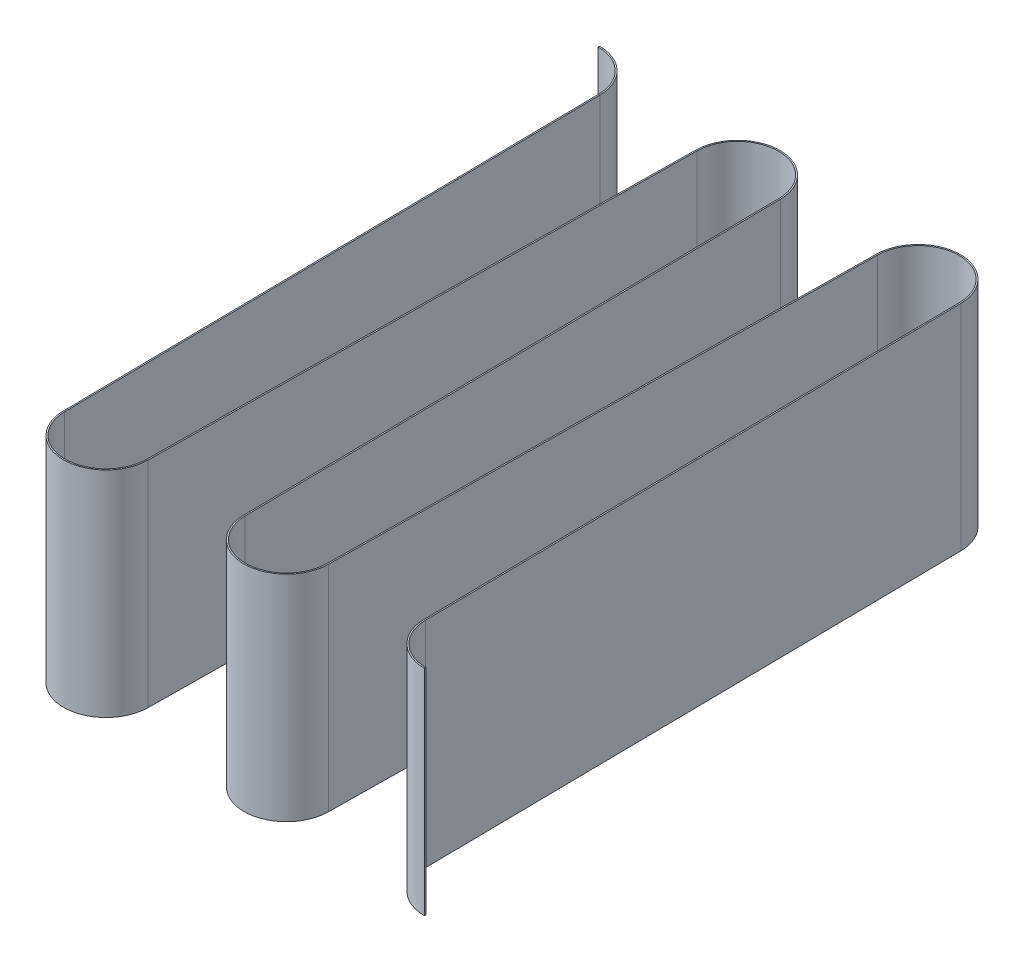
ISO-10303-21;
HEADER;
FILE_DESCRIPTION(('STEP AP214'),'2;1');
FILE_NAME('part.step','',(''),(''),'','','');
FILE_SCHEMA(('AUTOMOTIVE_DESIGN { 1 0 10303 214 1 1 1 1 }'));
ENDSEC;
DATA;
#1=APPLICATION_CONTEXT('core data for automotive mechanical design processes');
#2=APPLICATION_PROTOCOL_DEFINITION('international standard','automotive_design',2000,#1);
#3=PRODUCT_CONTEXT('',#1,'mechanical');
#4=PRODUCT('Part','Part','',(#3));
#5=PRODUCT_RELATED_PRODUCT_CATEGORY('part','',(#4));
#6=PRODUCT_DEFINITION_FORMATION('','',#4);
#7=PRODUCT_DEFINITION_CONTEXT('part definition',#1,'design');
#8=PRODUCT_DEFINITION('design','',#6,#7);
#9=PRODUCT_DEFINITION_SHAPE('','',#8);
#10=(LENGTH_UNIT() NAMED_UNIT(*) SI_UNIT(.MILLI.,.METRE.));
#11=(NAMED_UNIT(*) PLANE_ANGLE_UNIT() SI_UNIT($,.RADIAN.));
#12=(NAMED_UNIT(*) SI_UNIT($,.STERADIAN.) SOLID_ANGLE_UNIT());
#13=UNCERTAINTY_MEASURE_WITH_UNIT(LENGTH_MEASURE(1.E-05),#10,'distance_accuracy_value','');
#14=(GEOMETRIC_REPRESENTATION_CONTEXT(3) GLOBAL_UNCERTAINTY_ASSIGNED_CONTEXT((#13)) GLOBAL_UNIT_ASSIGNED_CONTEXT((#10,
#11,#12)) REPRESENTATION_CONTEXT('',''));
#15=CARTESIAN_POINT('',(0.,0.,0.));
#16=DIRECTION('',(0.,0.,1.));
#17=DIRECTION('',(1.,0.,0.));
#18=AXIS2_PLACEMENT_3D('',#15,#16,#17);
#19=CARTESIAN_POINT('',(-50.5,24.,-60.6));
#20=DIRECTION('',(0.,-1.,0.));
#21=DIRECTION('',(0.,0.,-1.));
#22=AXIS2_PLACEMENT_3D('',#19,#20,#21);
#23=CYLINDRICAL_SURFACE('',#22,9.2);
#24=CARTESIAN_POINT('',(-50.5,-24.,-60.6));
#25=DIRECTION('',(0.,-1.,0.));
#26=DIRECTION('',(0.,0.,-1.));
#27=AXIS2_PLACEMENT_3D('',#24,#25,#26);
#28=CIRCLE('',#27,9.2);
#29=CARTESIAN_POINT('',(-50.5,-24.,-69.8));
#30=VERTEX_POINT('',#29);
#31=CARTESIAN_POINT('',(-41.3007031649809,-24.,-60.7137441919751));
#32=VERTEX_POINT('',#31);
#33=EDGE_CURVE('E229',#30,#32,#28,.T.);
#34=ORIENTED_EDGE('',*,*,#33,.T.);
#35=DIRECTION('',(0.,-1.,0.));
#36=VECTOR('',#35,1.);
#37=CARTESIAN_POINT('',(-41.3007031649809,24.,-60.7137441919751));
#38=LINE('',#37,#36);
#39=CARTESIAN_POINT('',(-41.3007031649809,24.,-60.7137441919751));
#40=VERTEX_POINT('',#39);
#41=EDGE_CURVE('E11',#40,#32,#38,.T.);
#42=ORIENTED_EDGE('',*,*,#41,.F.);
#43=CARTESIAN_POINT('',(-50.5,24.,-60.6));
#44=DIRECTION('',(0.,-1.,0.));
#45=DIRECTION('',(0.,0.,-1.));
#46=AXIS2_PLACEMENT_3D('',#43,#44,#45);
#47=CIRCLE('',#46,9.2);
#48=CARTESIAN_POINT('',(-50.5,24.,-69.8));
#49=VERTEX_POINT('',#48);
#50=EDGE_CURVE('E275',#49,#40,#47,.T.);
#51=ORIENTED_EDGE('',*,*,#50,.F.);
#52=DIRECTION('',(0.,-1.,0.));
#53=VECTOR('',#52,1.);
#54=CARTESIAN_POINT('',(-50.5,24.,-69.8));
#55=LINE('',#54,#53);
#56=EDGE_CURVE('E225',#49,#30,#55,.T.);
#57=ORIENTED_EDGE('',*,*,#56,.T.);
#58=EDGE_LOOP('',(#34,#42,#51,#57));
#59=FACE_BOUND('',#58,.T.);
#60=ADVANCED_FACE('F37',(#59),#23,.F.);
#61=CARTESIAN_POINT('',(-41.3007031649809,24.,-60.7137441919751));
#62=DIRECTION('',(0.999923569023812,0.,-0.0123634991277312));
#63=DIRECTION('',(-0.0123634991277312,0.,-0.999923569023812));
#64=AXIS2_PLACEMENT_3D('',#61,#62,#63);
#65=PLANE('',#64);
#66=DIRECTION('',(0.0123634991277312,0.,0.999923569023812));
#67=VECTOR('',#66,1.);
#68=CARTESIAN_POINT('',(-41.3007031649809,-24.,-60.7137441919751));
#69=LINE('',#68,#67);
#70=CARTESIAN_POINT('',(-39.7992739057262,-24.,60.7174532417135));
#71=VERTEX_POINT('',#70);
#72=EDGE_CURVE('E232',#32,#71,#69,.T.);
#73=ORIENTED_EDGE('',*,*,#72,.T.);
#74=DIRECTION('',(0.,-1.,0.));
#75=VECTOR('',#74,1.);
#76=CARTESIAN_POINT('',(-39.7992739057262,24.,60.7174532417135));
#77=LINE('',#76,#75);
#78=CARTESIAN_POINT('',(-39.7992739057262,24.,60.7174532417135));
#79=VERTEX_POINT('',#78);
#80=EDGE_CURVE('E45',#79,#71,#77,.T.);
#81=ORIENTED_EDGE('',*,*,#80,.F.);
#82=DIRECTION('',(0.0123634991277312,0.,0.999923569023812));
#83=VECTOR('',#82,1.);
#84=CARTESIAN_POINT('',(-41.3007031649809,24.,-60.7137441919751));
#85=LINE('',#84,#83);
#86=EDGE_CURVE('E144',#40,#79,#85,.T.);
#87=ORIENTED_EDGE('',*,*,#86,.F.);
#88=ORIENTED_EDGE('',*,*,#41,.T.);
#89=EDGE_LOOP('',(#73,#81,#87,#88));
#90=FACE_BOUND('',#89,.T.);
#91=ADVANCED_FACE('F413',(#90),#65,.F.);
#92=CARTESIAN_POINT('',(-30.3,24.,60.6));
#93=DIRECTION('',(0.,-1.,0.));
#94=DIRECTION('',(0.,0.,-1.));
#95=AXIS2_PLACEMENT_3D('',#92,#93,#94);
#96=CYLINDRICAL_SURFACE('',#95,9.5);
#97=CARTESIAN_POINT('',(-30.3,-24.,60.6));
#98=DIRECTION('',(0.,1.,0.));
#99=DIRECTION('',(0.,0.,1.));
#100=AXIS2_PLACEMENT_3D('',#97,#98,#99);
#101=CIRCLE('',#100,9.5);
#102=CARTESIAN_POINT('',(-20.8007260942738,-24.,60.7174532417135));
#103=VERTEX_POINT('',#102);
#104=EDGE_CURVE('E234',#71,#103,#101,.T.);
#105=ORIENTED_EDGE('',*,*,#104,.T.);
#106=DIRECTION('',(0.,-1.,0.));
#107=VECTOR('',#106,1.);
#108=CARTESIAN_POINT('',(-20.8007260942738,24.,60.7174532417135));
#109=LINE('',#108,#107);
#110=CARTESIAN_POINT('',(-20.8007260942738,24.,60.7174532417135));
#111=VERTEX_POINT('',#110);
#112=EDGE_CURVE('E330',#111,#103,#109,.T.);
#113=ORIENTED_EDGE('',*,*,#112,.F.);
#114=CARTESIAN_POINT('',(-30.3,24.,60.6));
#115=DIRECTION('',(0.,1.,0.));
#116=DIRECTION('',(0.,0.,1.));
#117=AXIS2_PLACEMENT_3D('',#114,#115,#116);
#118=CIRCLE('',#117,9.5);
#119=EDGE_CURVE('E338',#79,#111,#118,.T.);
#120=ORIENTED_EDGE('',*,*,#119,.F.);
#121=ORIENTED_EDGE('',*,*,#80,.T.);
#122=EDGE_LOOP('',(#105,#113,#120,#121));
#123=FACE_BOUND('',#122,.T.);
#124=ADVANCED_FACE('F336',(#123),#96,.T.);
#125=CARTESIAN_POINT('',(-19.2992968350191,24.,-60.7137441919751));
#126=DIRECTION('',(-0.999923569023812,0.,-0.012363499127731));
#127=DIRECTION('',(-0.012363499127731,0.,0.999923569023812));
#128=AXIS2_PLACEMENT_3D('',#125,#126,#127);
#129=PLANE('',#128);
#130=DIRECTION('',(0.012363499127731,0.,-0.999923569023812));
#131=VECTOR('',#130,1.);
#132=CARTESIAN_POINT('',(-19.2992968350191,-24.,-60.7137441919751));
#133=LINE('',#132,#131);
#134=CARTESIAN_POINT('',(-19.2992968350191,-24.,-60.7137441919751));
#135=VERTEX_POINT('',#134);
#136=EDGE_CURVE('E236',#103,#135,#133,.T.);
#137=ORIENTED_EDGE('',*,*,#136,.T.);
#138=DIRECTION('',(0.,-1.,0.));
#139=VECTOR('',#138,1.);
#140=CARTESIAN_POINT('',(-19.2992968350191,24.,-60.7137441919751));
#141=LINE('',#140,#139);
#142=CARTESIAN_POINT('',(-19.2992968350191,24.,-60.7137441919751));
#143=VERTEX_POINT('',#142);
#144=EDGE_CURVE('E327',#143,#135,#141,.T.);
#145=ORIENTED_EDGE('',*,*,#144,.F.);
#146=DIRECTION('',(0.012363499127731,0.,-0.999923569023812));
#147=VECTOR('',#146,1.);
#148=CARTESIAN_POINT('',(-19.2992968350191,24.,-60.7137441919751));
#149=LINE('',#148,#147);
#150=EDGE_CURVE('E356',#111,#143,#149,.T.);
#151=ORIENTED_EDGE('',*,*,#150,.F.);
#152=ORIENTED_EDGE('',*,*,#112,.T.);
#153=EDGE_LOOP('',(#137,#145,#151,#152));
#154=FACE_BOUND('',#153,.T.);
#155=ADVANCED_FACE('F347',(#154),#129,.F.);
#156=CARTESIAN_POINT('',(-10.1,24.,-60.6));
#157=DIRECTION('',(0.,-1.,0.));
#158=DIRECTION('',(0.,0.,-1.));
#159=AXIS2_PLACEMENT_3D('',#156,#157,#158);
#160=CYLINDRICAL_SURFACE('',#159,9.2);
#161=CARTESIAN_POINT('',(-10.1,-24.,-60.6));
#162=DIRECTION('',(0.,-1.,0.));
#163=DIRECTION('',(0.,0.,-1.));
#164=AXIS2_PLACEMENT_3D('',#161,#162,#163);
#165=CIRCLE('',#164,9.2);
#166=CARTESIAN_POINT('',(-0.900703164980924,-24.,-60.7137441919751));
#167=VERTEX_POINT('',#166);
#168=EDGE_CURVE('E238',#135,#167,#165,.T.);
#169=ORIENTED_EDGE('',*,*,#168,.T.);
#170=DIRECTION('',(0.,-1.,0.));
#171=VECTOR('',#170,1.);
#172=CARTESIAN_POINT('',(-0.900703164980924,24.,-60.7137441919751));
#173=LINE('',#172,#171);
#174=CARTESIAN_POINT('',(-0.900703164980924,24.,-60.7137441919751));
#175=VERTEX_POINT('',#174);
#176=EDGE_CURVE('E324',#175,#167,#173,.T.);
#177=ORIENTED_EDGE('',*,*,#176,.F.);
#178=CARTESIAN_POINT('',(-10.1,24.,-60.6));
#179=DIRECTION('',(0.,-1.,0.));
#180=DIRECTION('',(0.,0.,-1.));
#181=AXIS2_PLACEMENT_3D('',#178,#179,#180);
#182=CIRCLE('',#181,9.2);
#183=EDGE_CURVE('E353',#143,#175,#182,.T.);
#184=ORIENTED_EDGE('',*,*,#183,.F.);
#185=ORIENTED_EDGE('',*,*,#144,.T.);
#186=EDGE_LOOP('',(#169,#177,#184,#185));
#187=FACE_BOUND('',#186,.T.);
#188=ADVANCED_FACE('F351',(#187),#160,.F.);
#189=CARTESIAN_POINT('',(-0.900703164980924,24.,-60.7137441919751));
#190=DIRECTION('',(0.999923569023812,0.,-0.0123634991277313));
#191=DIRECTION('',(-0.0123634991277313,0.,-0.999923569023812));
#192=AXIS2_PLACEMENT_3D('',#189,#190,#191);
#193=PLANE('',#192);
#194=DIRECTION('',(0.0123634991277313,0.,0.999923569023812));
#195=VECTOR('',#194,1.);
#196=CARTESIAN_POINT('',(-0.900703164980924,-24.,-60.7137441919751));
#197=LINE('',#196,#195);
#198=CARTESIAN_POINT('',(0.600726094273816,-24.,60.7174532417135));
#199=VERTEX_POINT('',#198);
#200=EDGE_CURVE('E240',#167,#199,#197,.T.);
#201=ORIENTED_EDGE('',*,*,#200,.T.);
#202=DIRECTION('',(0.,-1.,0.));
#203=VECTOR('',#202,1.);
#204=CARTESIAN_POINT('',(0.600726094273816,24.,60.7174532417135));
#205=LINE('',#204,#203);
#206=CARTESIAN_POINT('',(0.600726094273816,24.,60.7174532417135));
#207=VERTEX_POINT('',#206);
#208=EDGE_CURVE('E321',#207,#199,#205,.T.);
#209=ORIENTED_EDGE('',*,*,#208,.F.);
#210=DIRECTION('',(0.0123634991277313,0.,0.999923569023812));
#211=VECTOR('',#210,1.);
#212=CARTESIAN_POINT('',(-0.900703164980924,24.,-60.7137441919751));
#213=LINE('',#212,#211);
#214=EDGE_CURVE('E355',#175,#207,#213,.T.);
#215=ORIENTED_EDGE('',*,*,#214,.F.);
#216=ORIENTED_EDGE('',*,*,#176,.T.);
#217=EDGE_LOOP('',(#201,#209,#215,#216));
#218=FACE_BOUND('',#217,.T.);
#219=ADVANCED_FACE('F426',(#218),#193,.F.);
#220=CARTESIAN_POINT('',(10.1,24.,60.6));
#221=DIRECTION('',(0.,-1.,0.));
#222=DIRECTION('',(0.,0.,-1.));
#223=AXIS2_PLACEMENT_3D('',#220,#221,#222);
#224=CYLINDRICAL_SURFACE('',#223,9.5);
#225=CARTESIAN_POINT('',(10.1,-24.,60.6));
#226=DIRECTION('',(0.,1.,0.));
#227=DIRECTION('',(0.,0.,1.));
#228=AXIS2_PLACEMENT_3D('',#225,#226,#227);
#229=CIRCLE('',#228,9.5);
#230=CARTESIAN_POINT('',(19.5992739057262,-24.,60.7174532417135));
#231=VERTEX_POINT('',#230);
#232=EDGE_CURVE('E242',#199,#231,#229,.T.);
#233=ORIENTED_EDGE('',*,*,#232,.T.);
#234=DIRECTION('',(0.,-1.,0.));
#235=VECTOR('',#234,1.);
#236=CARTESIAN_POINT('',(19.5992739057262,24.,60.7174532417135));
#237=LINE('',#236,#235);
#238=CARTESIAN_POINT('',(19.5992739057262,24.,60.7174532417135));
#239=VERTEX_POINT('',#238);
#240=EDGE_CURVE('E318',#239,#231,#237,.T.);
#241=ORIENTED_EDGE('',*,*,#240,.F.);
#242=CARTESIAN_POINT('',(10.1,24.,60.6));
#243=DIRECTION('',(0.,1.,0.));
#244=DIRECTION('',(0.,0.,1.));
#245=AXIS2_PLACEMENT_3D('',#242,#243,#244);
#246=CIRCLE('',#245,9.5);
#247=EDGE_CURVE('E358',#207,#239,#246,.T.);
#248=ORIENTED_EDGE('',*,*,#247,.F.);
#249=ORIENTED_EDGE('',*,*,#208,.T.);
#250=EDGE_LOOP('',(#233,#241,#248,#249));
#251=FACE_BOUND('',#250,.T.);
#252=ADVANCED_FACE('F429',(#251),#224,.T.);
#253=CARTESIAN_POINT('',(19.5992739057262,24.,60.7174532417135));
#254=DIRECTION('',(-0.999923569023812,0.,-0.012363499127731));
#255=DIRECTION('',(-0.012363499127731,0.,0.999923569023812));
#256=AXIS2_PLACEMENT_3D('',#253,#254,#255);
#257=PLANE('',#256);
#258=DIRECTION('',(0.012363499127731,0.,-0.999923569023812));
#259=VECTOR('',#258,1.);
#260=CARTESIAN_POINT('',(19.5992739057262,-24.,60.7174532417135));
#261=LINE('',#260,#259);
#262=CARTESIAN_POINT('',(21.1007031649809,-24.,-60.7137441919751));
#263=VERTEX_POINT('',#262);
#264=EDGE_CURVE('E244',#231,#263,#261,.T.);
#265=ORIENTED_EDGE('',*,*,#264,.T.);
#266=DIRECTION('',(0.,-1.,0.));
#267=VECTOR('',#266,1.);
#268=CARTESIAN_POINT('',(21.1007031649809,24.,-60.7137441919751));
#269=LINE('',#268,#267);
#270=CARTESIAN_POINT('',(21.1007031649809,24.,-60.7137441919751));
#271=VERTEX_POINT('',#270);
#272=EDGE_CURVE('E315',#271,#263,#269,.T.);
#273=ORIENTED_EDGE('',*,*,#272,.F.);
#274=DIRECTION('',(0.012363499127731,0.,-0.999923569023812));
#275=VECTOR('',#274,1.);
#276=CARTESIAN_POINT('',(19.5992739057262,24.,60.7174532417135));
#277=LINE('',#276,#275);
#278=EDGE_CURVE('E364',#239,#271,#277,.T.);
#279=ORIENTED_EDGE('',*,*,#278,.F.);
#280=ORIENTED_EDGE('',*,*,#240,.T.);
#281=EDGE_LOOP('',(#265,#273,#279,#280));
#282=FACE_BOUND('',#281,.T.);
#283=ADVANCED_FACE('F433',(#282),#257,.F.);
#284=CARTESIAN_POINT('',(30.3,24.,-60.6));
#285=DIRECTION('',(0.,-1.,0.));
#286=DIRECTION('',(0.,0.,-1.));
#287=AXIS2_PLACEMENT_3D('',#284,#285,#286);
#288=CYLINDRICAL_SURFACE('',#287,9.2);
#289=CARTESIAN_POINT('',(30.3,-24.,-60.6));
#290=DIRECTION('',(0.,-1.,0.));
#291=DIRECTION('',(0.,0.,-1.));
#292=AXIS2_PLACEMENT_3D('',#289,#290,#291);
#293=CIRCLE('',#292,9.2);
#294=CARTESIAN_POINT('',(39.4992968350191,-24.,-60.7137441919751));
#295=VERTEX_POINT('',#294);
#296=EDGE_CURVE('E246',#263,#295,#293,.T.);
#297=ORIENTED_EDGE('',*,*,#296,.T.);
#298=DIRECTION('',(0.,-1.,0.));
#299=VECTOR('',#298,1.);
#300=CARTESIAN_POINT('',(39.4992968350191,24.,-60.7137441919751));
#301=LINE('',#300,#299);
#302=CARTESIAN_POINT('',(39.4992968350191,24.,-60.7137441919751));
#303=VERTEX_POINT('',#302);
#304=EDGE_CURVE('E312',#303,#295,#301,.T.);
#305=ORIENTED_EDGE('',*,*,#304,.F.);
#306=CARTESIAN_POINT('',(30.3,24.,-60.6));
#307=DIRECTION('',(0.,-1.,0.));
#308=DIRECTION('',(0.,0.,-1.));
#309=AXIS2_PLACEMENT_3D('',#306,#307,#308);
#310=CIRCLE('',#309,9.2);
#311=EDGE_CURVE('E366',#271,#303,#310,.T.);
#312=ORIENTED_EDGE('',*,*,#311,.F.);
#313=ORIENTED_EDGE('',*,*,#272,.T.);
#314=EDGE_LOOP('',(#297,#305,#312,#313));
#315=FACE_BOUND('',#314,.T.);
#316=ADVANCED_FACE('F437',(#315),#288,.F.);
#317=CARTESIAN_POINT('',(39.4992968350191,24.,-60.7137441919751));
#318=DIRECTION('',(0.999923569023812,0.,-0.0123634991277312));
#319=DIRECTION('',(-0.0123634991277312,0.,-0.999923569023812));
#320=AXIS2_PLACEMENT_3D('',#317,#318,#319);
#321=PLANE('',#320);
#322=DIRECTION('',(0.0123634991277312,0.,0.999923569023812));
#323=VECTOR('',#322,1.);
#324=CARTESIAN_POINT('',(39.4992968350191,-24.,-60.7137441919751));
#325=LINE('',#324,#323);
#326=CARTESIAN_POINT('',(41.0007260942738,-24.,60.7174532417135));
#327=VERTEX_POINT('',#326);
#328=EDGE_CURVE('E248',#295,#327,#325,.T.);
#329=ORIENTED_EDGE('',*,*,#328,.T.);
#330=DIRECTION('',(0.,-1.,0.));
#331=VECTOR('',#330,1.);
#332=CARTESIAN_POINT('',(41.0007260942738,24.,60.7174532417135));
#333=LINE('',#332,#331);
#334=CARTESIAN_POINT('',(41.0007260942738,24.,60.7174532417135));
#335=VERTEX_POINT('',#334);
#336=EDGE_CURVE('E309',#335,#327,#333,.T.);
#337=ORIENTED_EDGE('',*,*,#336,.F.);
#338=DIRECTION('',(0.0123634991277312,0.,0.999923569023812));
#339=VECTOR('',#338,1.);
#340=CARTESIAN_POINT('',(39.4992968350191,24.,-60.7137441919751));
#341=LINE('',#340,#339);
#342=EDGE_CURVE('E368',#303,#335,#341,.T.);
#343=ORIENTED_EDGE('',*,*,#342,.F.);
#344=ORIENTED_EDGE('',*,*,#304,.T.);
#345=EDGE_LOOP('',(#329,#337,#343,#344));
#346=FACE_BOUND('',#345,.T.);
#347=ADVANCED_FACE('F441',(#346),#321,.F.);
#348=CARTESIAN_POINT('',(50.5,24.,60.6));
#349=DIRECTION('',(0.,-1.,0.));
#350=DIRECTION('',(0.,0.,-1.));
#351=AXIS2_PLACEMENT_3D('',#348,#349,#350);
#352=CYLINDRICAL_SURFACE('',#351,9.5);
#353=CARTESIAN_POINT('',(50.5,-24.,60.6));
#354=DIRECTION('',(0.,1.,0.));
#355=DIRECTION('',(0.,0.,1.));
#356=AXIS2_PLACEMENT_3D('',#353,#354,#355);
#357=CIRCLE('',#356,9.5);
#358=CARTESIAN_POINT('',(50.5,-24.,70.1));
#359=VERTEX_POINT('',#358);
#360=EDGE_CURVE('E250',#327,#359,#357,.T.);
#361=ORIENTED_EDGE('',*,*,#360,.T.);
#362=DIRECTION('',(0.,-1.,0.));
#363=VECTOR('',#362,1.);
#364=CARTESIAN_POINT('',(50.5,24.,70.1));
#365=LINE('',#364,#363);
#366=CARTESIAN_POINT('',(50.5,24.,70.1));
#367=VERTEX_POINT('',#366);
#368=EDGE_CURVE('E306',#367,#359,#365,.T.);
#369=ORIENTED_EDGE('',*,*,#368,.F.);
#370=CARTESIAN_POINT('',(50.5,24.,60.6));
#371=DIRECTION('',(0.,1.,0.));
#372=DIRECTION('',(0.,0.,1.));
#373=AXIS2_PLACEMENT_3D('',#370,#371,#372);
#374=CIRCLE('',#373,9.5);
#375=EDGE_CURVE('E370',#335,#367,#374,.T.);
#376=ORIENTED_EDGE('',*,*,#375,.F.);
#377=ORIENTED_EDGE('',*,*,#336,.T.);
#378=EDGE_LOOP('',(#361,#369,#376,#377));
#379=FACE_BOUND('',#378,.T.);
#380=ADVANCED_FACE('F445',(#379),#352,.T.);
#381=CARTESIAN_POINT('',(50.5,24.,70.1));
#382=DIRECTION('',(-1.,0.,0.));
#383=DIRECTION('',(0.,0.,1.));
#384=AXIS2_PLACEMENT_3D('',#381,#382,#383);
#385=PLANE('',#384);
#386=DIRECTION('',(0.,0.,-1.));
#387=VECTOR('',#386,1.);
#388=CARTESIAN_POINT('',(50.5,-24.,70.1));
#389=LINE('',#388,#387);
#390=CARTESIAN_POINT('',(50.5,-24.,69.8));
#391=VERTEX_POINT('',#390);
#392=EDGE_CURVE('E252',#359,#391,#389,.T.);
#393=ORIENTED_EDGE('',*,*,#392,.T.);
#394=DIRECTION('',(0.,-1.,0.));
#395=VECTOR('',#394,1.);
#396=CARTESIAN_POINT('',(50.5,24.,69.8));
#397=LINE('',#396,#395);
#398=CARTESIAN_POINT('',(50.5,24.,69.8));
#399=VERTEX_POINT('',#398);
#400=EDGE_CURVE('E303',#399,#391,#397,.T.);
#401=ORIENTED_EDGE('',*,*,#400,.F.);
#402=DIRECTION('',(0.,0.,-1.));
#403=VECTOR('',#402,1.);
#404=CARTESIAN_POINT('',(50.5,24.,70.1));
#405=LINE('',#404,#403);
#406=EDGE_CURVE('E372',#367,#399,#405,.T.);
#407=ORIENTED_EDGE('',*,*,#406,.F.);
#408=ORIENTED_EDGE('',*,*,#368,.T.);
#409=EDGE_LOOP('',(#393,#401,#407,#408));
#410=FACE_BOUND('',#409,.T.);
#411=ADVANCED_FACE('F449',(#410),#385,.F.);
#412=CARTESIAN_POINT('',(50.5,24.,60.6));
#413=DIRECTION('',(0.,-1.,0.));
#414=DIRECTION('',(0.,0.,-1.));
#415=AXIS2_PLACEMENT_3D('',#412,#413,#414);
#416=CYLINDRICAL_SURFACE('',#415,9.2);
#417=CARTESIAN_POINT('',(50.5,-24.,60.6));
#418=DIRECTION('',(0.,-1.,0.));
#419=DIRECTION('',(0.,0.,1.));
#420=AXIS2_PLACEMENT_3D('',#417,#418,#419);
#421=CIRCLE('',#420,9.2);
#422=CARTESIAN_POINT('',(41.3007031649809,-24.,60.7137441919752));
#423=VERTEX_POINT('',#422);
#424=EDGE_CURVE('E254',#391,#423,#421,.T.);
#425=ORIENTED_EDGE('',*,*,#424,.T.);
#426=DIRECTION('',(0.,-1.,0.));
#427=VECTOR('',#426,1.);
#428=CARTESIAN_POINT('',(41.3007031649809,24.,60.7137441919752));
#429=LINE('',#428,#427);
#430=CARTESIAN_POINT('',(41.3007031649809,24.,60.7137441919752));
#431=VERTEX_POINT('',#430);
#432=EDGE_CURVE('E300',#431,#423,#429,.T.);
#433=ORIENTED_EDGE('',*,*,#432,.F.);
#434=CARTESIAN_POINT('',(50.5,24.,60.6));
#435=DIRECTION('',(0.,-1.,0.));
#436=DIRECTION('',(0.,0.,1.));
#437=AXIS2_PLACEMENT_3D('',#434,#435,#436);
#438=CIRCLE('',#437,9.2);
#439=EDGE_CURVE('E374',#399,#431,#438,.T.);
#440=ORIENTED_EDGE('',*,*,#439,.F.);
#441=ORIENTED_EDGE('',*,*,#400,.T.);
#442=EDGE_LOOP('',(#425,#433,#440,#441));
#443=FACE_BOUND('',#442,.T.);
#444=ADVANCED_FACE('F453',(#443),#416,.F.);
#445=CARTESIAN_POINT('',(39.7992739057262,24.,-60.7174532417134));
#446=DIRECTION('',(-0.999923569023812,0.,0.0123634991277312));
#447=DIRECTION('',(0.0123634991277312,0.,0.999923569023812));
#448=AXIS2_PLACEMENT_3D('',#445,#446,#447);
#449=PLANE('',#448);
#450=DIRECTION('',(-0.0123634991277312,0.,-0.999923569023812));
#451=VECTOR('',#450,1.);
#452=CARTESIAN_POINT('',(39.7992739057262,-24.,-60.7174532417134));
#453=LINE('',#452,#451);
#454=CARTESIAN_POINT('',(39.7992739057262,-24.,-60.7174532417134));
#455=VERTEX_POINT('',#454);
#456=EDGE_CURVE('E256',#423,#455,#453,.T.);
#457=ORIENTED_EDGE('',*,*,#456,.T.);
#458=DIRECTION('',(0.,-1.,0.));
#459=VECTOR('',#458,1.);
#460=CARTESIAN_POINT('',(39.7992739057262,24.,-60.7174532417134));
#461=LINE('',#460,#459);
#462=CARTESIAN_POINT('',(39.7992739057262,24.,-60.7174532417134));
#463=VERTEX_POINT('',#462);
#464=EDGE_CURVE('E297',#463,#455,#461,.T.);
#465=ORIENTED_EDGE('',*,*,#464,.F.);
#466=DIRECTION('',(-0.0123634991277312,0.,-0.999923569023812));
#467=VECTOR('',#466,1.);
#468=CARTESIAN_POINT('',(39.7992739057262,24.,-60.7174532417134));
#469=LINE('',#468,#467);
#470=EDGE_CURVE('E376',#431,#463,#469,.T.);
#471=ORIENTED_EDGE('',*,*,#470,.F.);
#472=ORIENTED_EDGE('',*,*,#432,.T.);
#473=EDGE_LOOP('',(#457,#465,#471,#472));
#474=FACE_BOUND('',#473,.T.);
#475=ADVANCED_FACE('F457',(#474),#449,.F.);
#476=CARTESIAN_POINT('',(30.3,24.,-60.6));
#477=DIRECTION('',(0.,-1.,0.));
#478=DIRECTION('',(0.,0.,-1.));
#479=AXIS2_PLACEMENT_3D('',#476,#477,#478);
#480=CYLINDRICAL_SURFACE('',#479,9.5);
#481=CARTESIAN_POINT('',(30.3,-24.,-60.6));
#482=DIRECTION('',(0.,1.,0.));
#483=DIRECTION('',(0.,0.,-1.));
#484=AXIS2_PLACEMENT_3D('',#481,#482,#483);
#485=CIRCLE('',#484,9.5);
#486=CARTESIAN_POINT('',(20.8007260942738,-24.,-60.7174532417134));
#487=VERTEX_POINT('',#486);
#488=EDGE_CURVE('E258',#455,#487,#485,.T.);
#489=ORIENTED_EDGE('',*,*,#488,.T.);
#490=DIRECTION('',(0.,-1.,0.));
#491=VECTOR('',#490,1.);
#492=CARTESIAN_POINT('',(20.8007260942738,24.,-60.7174532417134));
#493=LINE('',#492,#491);
#494=CARTESIAN_POINT('',(20.8007260942738,24.,-60.7174532417134));
#495=VERTEX_POINT('',#494);
#496=EDGE_CURVE('E294',#495,#487,#493,.T.);
#497=ORIENTED_EDGE('',*,*,#496,.F.);
#498=CARTESIAN_POINT('',(30.3,24.,-60.6));
#499=DIRECTION('',(0.,1.,0.));
#500=DIRECTION('',(0.,0.,-1.));
#501=AXIS2_PLACEMENT_3D('',#498,#499,#500);
#502=CIRCLE('',#501,9.5);
#503=EDGE_CURVE('E378',#463,#495,#502,.T.);
#504=ORIENTED_EDGE('',*,*,#503,.F.);
#505=ORIENTED_EDGE('',*,*,#464,.T.);
#506=EDGE_LOOP('',(#489,#497,#504,#505));
#507=FACE_BOUND('',#506,.T.);
#508=ADVANCED_FACE('F461',(#507),#480,.T.);
#509=CARTESIAN_POINT('',(19.2992968350191,24.,60.7137441919751));
#510=DIRECTION('',(0.999923569023812,0.,0.012363499127731));
#511=DIRECTION('',(0.012363499127731,0.,-0.999923569023812));
#512=AXIS2_PLACEMENT_3D('',#509,#510,#511);
#513=PLANE('',#512);
#514=DIRECTION('',(-0.012363499127731,0.,0.999923569023812));
#515=VECTOR('',#514,1.);
#516=CARTESIAN_POINT('',(19.2992968350191,-24.,60.7137441919751));
#517=LINE('',#516,#515);
#518=CARTESIAN_POINT('',(19.2992968350191,-24.,60.7137441919751));
#519=VERTEX_POINT('',#518);
#520=EDGE_CURVE('E260',#487,#519,#517,.T.);
#521=ORIENTED_EDGE('',*,*,#520,.T.);
#522=DIRECTION('',(0.,-1.,0.));
#523=VECTOR('',#522,1.);
#524=CARTESIAN_POINT('',(19.2992968350191,24.,60.7137441919751));
#525=LINE('',#524,#523);
#526=CARTESIAN_POINT('',(19.2992968350191,24.,60.7137441919751));
#527=VERTEX_POINT('',#526);
#528=EDGE_CURVE('E291',#527,#519,#525,.T.);
#529=ORIENTED_EDGE('',*,*,#528,.F.);
#530=DIRECTION('',(-0.012363499127731,0.,0.999923569023812));
#531=VECTOR('',#530,1.);
#532=CARTESIAN_POINT('',(19.2992968350191,24.,60.7137441919751));
#533=LINE('',#532,#531);
#534=EDGE_CURVE('E380',#495,#527,#533,.T.);
#535=ORIENTED_EDGE('',*,*,#534,.F.);
#536=ORIENTED_EDGE('',*,*,#496,.T.);
#537=EDGE_LOOP('',(#521,#529,#535,#536));
#538=FACE_BOUND('',#537,.T.);
#539=ADVANCED_FACE('F465',(#538),#513,.F.);
#540=CARTESIAN_POINT('',(10.1,24.,60.6));
#541=DIRECTION('',(0.,-1.,0.));
#542=DIRECTION('',(0.,0.,-1.));
#543=AXIS2_PLACEMENT_3D('',#540,#541,#542);
#544=CYLINDRICAL_SURFACE('',#543,9.2);
#545=CARTESIAN_POINT('',(10.1,-24.,60.6));
#546=DIRECTION('',(0.,-1.,0.));
#547=DIRECTION('',(0.,0.,1.));
#548=AXIS2_PLACEMENT_3D('',#545,#546,#547);
#549=CIRCLE('',#548,9.2);
#550=CARTESIAN_POINT('',(0.900703164980956,-24.,60.7137441919752));
#551=VERTEX_POINT('',#550);
#552=EDGE_CURVE('E262',#519,#551,#549,.T.);
#553=ORIENTED_EDGE('',*,*,#552,.T.);
#554=DIRECTION('',(0.,-1.,0.));
#555=VECTOR('',#554,1.);
#556=CARTESIAN_POINT('',(0.900703164980956,24.,60.7137441919752));
#557=LINE('',#556,#555);
#558=CARTESIAN_POINT('',(0.900703164980956,24.,60.7137441919752));
#559=VERTEX_POINT('',#558);
#560=EDGE_CURVE('E288',#559,#551,#557,.T.);
#561=ORIENTED_EDGE('',*,*,#560,.F.);
#562=CARTESIAN_POINT('',(10.1,24.,60.6));
#563=DIRECTION('',(0.,-1.,0.));
#564=DIRECTION('',(0.,0.,1.));
#565=AXIS2_PLACEMENT_3D('',#562,#563,#564);
#566=CIRCLE('',#565,9.2);
#567=EDGE_CURVE('E382',#527,#559,#566,.T.);
#568=ORIENTED_EDGE('',*,*,#567,.F.);
#569=ORIENTED_EDGE('',*,*,#528,.T.);
#570=EDGE_LOOP('',(#553,#561,#568,#569));
#571=FACE_BOUND('',#570,.T.);
#572=ADVANCED_FACE('F469',(#571),#544,.F.);
#573=CARTESIAN_POINT('',(-0.600726094273779,24.,-60.7174532417134));
#574=DIRECTION('',(-0.999923569023812,0.,0.0123634991277313));
#575=DIRECTION('',(0.0123634991277313,0.,0.999923569023812));
#576=AXIS2_PLACEMENT_3D('',#573,#574,#575);
#577=PLANE('',#576);
#578=DIRECTION('',(-0.0123634991277313,0.,-0.999923569023812));
#579=VECTOR('',#578,1.);
#580=CARTESIAN_POINT('',(-0.600726094273779,-24.,-60.7174532417134));
#581=LINE('',#580,#579);
#582=CARTESIAN_POINT('',(-0.600726094273779,-24.,-60.7174532417134));
#583=VERTEX_POINT('',#582);
#584=EDGE_CURVE('E264',#551,#583,#581,.T.);
#585=ORIENTED_EDGE('',*,*,#584,.T.);
#586=DIRECTION('',(0.,-1.,0.));
#587=VECTOR('',#586,1.);
#588=CARTESIAN_POINT('',(-0.600726094273779,24.,-60.7174532417134));
#589=LINE('',#588,#587);
#590=CARTESIAN_POINT('',(-0.600726094273779,24.,-60.7174532417134));
#591=VERTEX_POINT('',#590);
#592=EDGE_CURVE('E285',#591,#583,#589,.T.);
#593=ORIENTED_EDGE('',*,*,#592,.F.);
#594=DIRECTION('',(-0.0123634991277313,0.,-0.999923569023812));
#595=VECTOR('',#594,1.);
#596=CARTESIAN_POINT('',(-0.600726094273779,24.,-60.7174532417134));
#597=LINE('',#596,#595);
#598=EDGE_CURVE('E384',#559,#591,#597,.T.);
#599=ORIENTED_EDGE('',*,*,#598,.F.);
#600=ORIENTED_EDGE('',*,*,#560,.T.);
#601=EDGE_LOOP('',(#585,#593,#599,#600));
#602=FACE_BOUND('',#601,.T.);
#603=ADVANCED_FACE('F473',(#602),#577,.F.);
#604=CARTESIAN_POINT('',(-10.1,24.,-60.6));
#605=DIRECTION('',(0.,-1.,0.));
#606=DIRECTION('',(0.,0.,-1.));
#607=AXIS2_PLACEMENT_3D('',#604,#605,#606);
#608=CYLINDRICAL_SURFACE('',#607,9.5);
#609=CARTESIAN_POINT('',(-10.1,-24.,-60.6));
#610=DIRECTION('',(0.,1.,0.));
#611=DIRECTION('',(0.,0.,-1.));
#612=AXIS2_PLACEMENT_3D('',#609,#610,#611);
#613=CIRCLE('',#612,9.5);
#614=CARTESIAN_POINT('',(-19.5992739057262,-24.,-60.7174532417134));
#615=VERTEX_POINT('',#614);
#616=EDGE_CURVE('E266',#583,#615,#613,.T.);
#617=ORIENTED_EDGE('',*,*,#616,.T.);
#618=DIRECTION('',(0.,-1.,0.));
#619=VECTOR('',#618,1.);
#620=CARTESIAN_POINT('',(-19.5992739057262,24.,-60.7174532417134));
#621=LINE('',#620,#619);
#622=CARTESIAN_POINT('',(-19.5992739057262,24.,-60.7174532417134));
#623=VERTEX_POINT('',#622);
#624=EDGE_CURVE('E282',#623,#615,#621,.T.);
#625=ORIENTED_EDGE('',*,*,#624,.F.);
#626=CARTESIAN_POINT('',(-10.1,24.,-60.6));
#627=DIRECTION('',(0.,1.,0.));
#628=DIRECTION('',(0.,0.,-1.));
#629=AXIS2_PLACEMENT_3D('',#626,#627,#628);
#630=CIRCLE('',#629,9.5);
#631=EDGE_CURVE('E386',#591,#623,#630,.T.);
#632=ORIENTED_EDGE('',*,*,#631,.F.);
#633=ORIENTED_EDGE('',*,*,#592,.T.);
#634=EDGE_LOOP('',(#617,#625,#632,#633));
#635=FACE_BOUND('',#634,.T.);
#636=ADVANCED_FACE('F477',(#635),#608,.T.);
#637=CARTESIAN_POINT('',(-19.5992739057262,24.,-60.7174532417134));
#638=DIRECTION('',(0.999923569023812,0.,0.012363499127731));
#639=DIRECTION('',(0.012363499127731,0.,-0.999923569023812));
#640=AXIS2_PLACEMENT_3D('',#637,#638,#639);
#641=PLANE('',#640);
#642=DIRECTION('',(-0.012363499127731,0.,0.999923569023812));
#643=VECTOR('',#642,1.);
#644=CARTESIAN_POINT('',(-19.5992739057262,-24.,-60.7174532417134));
#645=LINE('',#644,#643);
#646=CARTESIAN_POINT('',(-21.1007031649809,-24.,60.7137441919751));
#647=VERTEX_POINT('',#646);
#648=EDGE_CURVE('E268',#615,#647,#645,.T.);
#649=ORIENTED_EDGE('',*,*,#648,.T.);
#650=DIRECTION('',(0.,-1.,0.));
#651=VECTOR('',#650,1.);
#652=CARTESIAN_POINT('',(-21.1007031649809,24.,60.7137441919751));
#653=LINE('',#652,#651);
#654=CARTESIAN_POINT('',(-21.1007031649809,24.,60.7137441919751));
#655=VERTEX_POINT('',#654);
#656=EDGE_CURVE('E279',#655,#647,#653,.T.);
#657=ORIENTED_EDGE('',*,*,#656,.F.);
#658=DIRECTION('',(-0.012363499127731,0.,0.999923569023812));
#659=VECTOR('',#658,1.);
#660=CARTESIAN_POINT('',(-19.5992739057262,24.,-60.7174532417134));
#661=LINE('',#660,#659);
#662=EDGE_CURVE('E388',#623,#655,#661,.T.);
#663=ORIENTED_EDGE('',*,*,#662,.F.);
#664=ORIENTED_EDGE('',*,*,#624,.T.);
#665=EDGE_LOOP('',(#649,#657,#663,#664));
#666=FACE_BOUND('',#665,.T.);
#667=ADVANCED_FACE('F394',(#666),#641,.F.);
#668=CARTESIAN_POINT('',(-30.3,24.,60.6));
#669=DIRECTION('',(0.,-1.,0.));
#670=DIRECTION('',(0.,0.,-1.));
#671=AXIS2_PLACEMENT_3D('',#668,#669,#670);
#672=CYLINDRICAL_SURFACE('',#671,9.2);
#673=CARTESIAN_POINT('',(-30.3,-24.,60.6));
#674=DIRECTION('',(0.,-1.,0.));
#675=DIRECTION('',(0.,0.,1.));
#676=AXIS2_PLACEMENT_3D('',#673,#674,#675);
#677=CIRCLE('',#676,9.2);
#678=CARTESIAN_POINT('',(-39.4992968350191,-24.,60.7137441919752));
#679=VERTEX_POINT('',#678);
#680=EDGE_CURVE('E270',#647,#679,#677,.T.);
#681=ORIENTED_EDGE('',*,*,#680,.T.);
#682=DIRECTION('',(0.,-1.,0.));
#683=VECTOR('',#682,1.);
#684=CARTESIAN_POINT('',(-39.4992968350191,24.,60.7137441919752));
#685=LINE('',#684,#683);
#686=CARTESIAN_POINT('',(-39.4992968350191,24.,60.7137441919752));
#687=VERTEX_POINT('',#686);
#688=EDGE_CURVE('E220',#687,#679,#685,.T.);
#689=ORIENTED_EDGE('',*,*,#688,.F.);
#690=CARTESIAN_POINT('',(-30.3,24.,60.6));
#691=DIRECTION('',(0.,-1.,0.));
#692=DIRECTION('',(0.,0.,1.));
#693=AXIS2_PLACEMENT_3D('',#690,#691,#692);
#694=CIRCLE('',#693,9.2);
#695=EDGE_CURVE('E211',#655,#687,#694,.T.);
#696=ORIENTED_EDGE('',*,*,#695,.F.);
#697=ORIENTED_EDGE('',*,*,#656,.T.);
#698=EDGE_LOOP('',(#681,#689,#696,#697));
#699=FACE_BOUND('',#698,.T.);
#700=ADVANCED_FACE('F398',(#699),#672,.F.);
#701=CARTESIAN_POINT('',(-41.0007260942738,24.,-60.7174532417134));
#702=DIRECTION('',(-0.999923569023812,0.,0.0123634991277312));
#703=DIRECTION('',(0.0123634991277312,0.,0.999923569023812));
#704=AXIS2_PLACEMENT_3D('',#701,#702,#703);
#705=PLANE('',#704);
#706=DIRECTION('',(-0.0123634991277312,0.,-0.999923569023812));
#707=VECTOR('',#706,1.);
#708=CARTESIAN_POINT('',(-41.0007260942738,-24.,-60.7174532417134));
#709=LINE('',#708,#707);
#710=CARTESIAN_POINT('',(-41.0007260942738,-24.,-60.7174532417134));
#711=VERTEX_POINT('',#710);
#712=EDGE_CURVE('E219',#679,#711,#709,.T.);
#713=ORIENTED_EDGE('',*,*,#712,.T.);
#714=DIRECTION('',(0.,-1.,0.));
#715=VECTOR('',#714,1.);
#716=CARTESIAN_POINT('',(-41.0007260942738,24.,-60.7174532417134));
#717=LINE('',#716,#715);
#718=CARTESIAN_POINT('',(-41.0007260942738,24.,-60.7174532417134));
#719=VERTEX_POINT('',#718);
#720=EDGE_CURVE('E216',#719,#711,#717,.T.);
#721=ORIENTED_EDGE('',*,*,#720,.F.);
#722=DIRECTION('',(-0.0123634991277312,0.,-0.999923569023812));
#723=VECTOR('',#722,1.);
#724=CARTESIAN_POINT('',(-41.0007260942738,24.,-60.7174532417134));
#725=LINE('',#724,#723);
#726=EDGE_CURVE('E205',#687,#719,#725,.T.);
#727=ORIENTED_EDGE('',*,*,#726,.F.);
#728=ORIENTED_EDGE('',*,*,#688,.T.);
#729=EDGE_LOOP('',(#713,#721,#727,#728));
#730=FACE_BOUND('',#729,.T.);
#731=ADVANCED_FACE('F217',(#730),#705,.F.);
#732=CARTESIAN_POINT('',(-50.5,24.,-60.6));
#733=DIRECTION('',(0.,-1.,0.));
#734=DIRECTION('',(0.,0.,-1.));
#735=AXIS2_PLACEMENT_3D('',#732,#733,#734);
#736=CYLINDRICAL_SURFACE('',#735,9.49999999999999);
#737=CARTESIAN_POINT('',(-50.5,-24.,-60.6));
#738=DIRECTION('',(0.,1.,0.));
#739=DIRECTION('',(0.,0.,-1.));
#740=AXIS2_PLACEMENT_3D('',#737,#738,#739);
#741=CIRCLE('',#740,9.49999999999999);
#742=CARTESIAN_POINT('',(-50.5,-24.,-70.1));
#743=VERTEX_POINT('',#742);
#744=EDGE_CURVE('E130',#711,#743,#741,.T.);
#745=ORIENTED_EDGE('',*,*,#744,.T.);
#746=DIRECTION('',(0.,-1.,0.));
#747=VECTOR('',#746,1.);
#748=CARTESIAN_POINT('',(-50.5,24.,-70.1));
#749=LINE('',#748,#747);
#750=CARTESIAN_POINT('',(-50.5,24.,-70.1));
#751=VERTEX_POINT('',#750);
#752=EDGE_CURVE('E221',#751,#743,#749,.T.);
#753=ORIENTED_EDGE('',*,*,#752,.F.);
#754=CARTESIAN_POINT('',(-50.5,24.,-60.6));
#755=DIRECTION('',(0.,1.,0.));
#756=DIRECTION('',(0.,0.,-1.));
#757=AXIS2_PLACEMENT_3D('',#754,#755,#756);
#758=CIRCLE('',#757,9.49999999999999);
#759=EDGE_CURVE('E209',#719,#751,#758,.T.);
#760=ORIENTED_EDGE('',*,*,#759,.F.);
#761=ORIENTED_EDGE('',*,*,#720,.T.);
#762=EDGE_LOOP('',(#745,#753,#760,#761));
#763=FACE_BOUND('',#762,.T.);
#764=ADVANCED_FACE('F223',(#763),#736,.T.);
#765=CARTESIAN_POINT('',(-50.5,24.,-69.8));
#766=DIRECTION('',(1.,0.,0.));
#767=DIRECTION('',(0.,0.,-1.));
#768=AXIS2_PLACEMENT_3D('',#765,#766,#767);
#769=PLANE('',#768);
#770=DIRECTION('',(0.,0.,1.));
#771=VECTOR('',#770,1.);
#772=CARTESIAN_POINT('',(-50.5,-24.,-69.8));
#773=LINE('',#772,#771);
#774=EDGE_CURVE('E136',#743,#30,#773,.T.);
#775=ORIENTED_EDGE('',*,*,#774,.T.);
#776=ORIENTED_EDGE('',*,*,#56,.F.);
#777=DIRECTION('',(0.,0.,1.));
#778=VECTOR('',#777,1.);
#779=CARTESIAN_POINT('',(-50.5,24.,-69.8));
#780=LINE('',#779,#778);
#781=EDGE_CURVE('E53',#751,#49,#780,.T.);
#782=ORIENTED_EDGE('',*,*,#781,.F.);
#783=ORIENTED_EDGE('',*,*,#752,.T.);
#784=EDGE_LOOP('',(#775,#776,#782,#783));
#785=FACE_BOUND('',#784,.T.);
#786=ADVANCED_FACE('F402',(#785),#769,.F.);
#787=CARTESIAN_POINT('',(-50.5,24.,-60.6));
#788=DIRECTION('',(0.,-1.,0.));
#789=DIRECTION('',(0.,0.,-1.));
#790=AXIS2_PLACEMENT_3D('',#787,#788,#789);
#791=PLANE('',#790);
#792=ORIENTED_EDGE('',*,*,#50,.T.);
#793=ORIENTED_EDGE('',*,*,#86,.T.);
#794=ORIENTED_EDGE('',*,*,#119,.T.);
#795=ORIENTED_EDGE('',*,*,#150,.T.);
#796=ORIENTED_EDGE('',*,*,#183,.T.);
#797=ORIENTED_EDGE('',*,*,#214,.T.);
#798=ORIENTED_EDGE('',*,*,#247,.T.);
#799=ORIENTED_EDGE('',*,*,#278,.T.);
#800=ORIENTED_EDGE('',*,*,#311,.T.);
#801=ORIENTED_EDGE('',*,*,#342,.T.);
#802=ORIENTED_EDGE('',*,*,#375,.T.);
#803=ORIENTED_EDGE('',*,*,#406,.T.);
#804=ORIENTED_EDGE('',*,*,#439,.T.);
#805=ORIENTED_EDGE('',*,*,#470,.T.);
#806=ORIENTED_EDGE('',*,*,#503,.T.);
#807=ORIENTED_EDGE('',*,*,#534,.T.);
#808=ORIENTED_EDGE('',*,*,#567,.T.);
#809=ORIENTED_EDGE('',*,*,#598,.T.);
#810=ORIENTED_EDGE('',*,*,#631,.T.);
#811=ORIENTED_EDGE('',*,*,#662,.T.);
#812=ORIENTED_EDGE('',*,*,#695,.T.);
#813=ORIENTED_EDGE('',*,*,#726,.T.);
#814=ORIENTED_EDGE('',*,*,#759,.T.);
#815=ORIENTED_EDGE('',*,*,#781,.T.);
#816=EDGE_LOOP('',(#792,#793,#794,#795,#796,#797,#798,#799,#800,#801,#802,#803,#804,#805,#806,
#807,#808,#809,#810,#811,#812,#813,#814,#815));
#817=FACE_BOUND('',#816,.T.);
#818=ADVANCED_FACE('F207',(#817),#791,.F.);
#819=CARTESIAN_POINT('',(-50.5,-24.,-60.6));
#820=DIRECTION('',(0.,-1.,0.));
#821=DIRECTION('',(0.,0.,-1.));
#822=AXIS2_PLACEMENT_3D('',#819,#820,#821);
#823=PLANE('',#822);
#824=ORIENTED_EDGE('',*,*,#33,.F.);
#825=ORIENTED_EDGE('',*,*,#774,.F.);
#826=ORIENTED_EDGE('',*,*,#744,.F.);
#827=ORIENTED_EDGE('',*,*,#712,.F.);
#828=ORIENTED_EDGE('',*,*,#680,.F.);
#829=ORIENTED_EDGE('',*,*,#648,.F.);
#830=ORIENTED_EDGE('',*,*,#616,.F.);
#831=ORIENTED_EDGE('',*,*,#584,.F.);
#832=ORIENTED_EDGE('',*,*,#552,.F.);
#833=ORIENTED_EDGE('',*,*,#520,.F.);
#834=ORIENTED_EDGE('',*,*,#488,.F.);
#835=ORIENTED_EDGE('',*,*,#456,.F.);
#836=ORIENTED_EDGE('',*,*,#424,.F.);
#837=ORIENTED_EDGE('',*,*,#392,.F.);
#838=ORIENTED_EDGE('',*,*,#360,.F.);
#839=ORIENTED_EDGE('',*,*,#328,.F.);
#840=ORIENTED_EDGE('',*,*,#296,.F.);
#841=ORIENTED_EDGE('',*,*,#264,.F.);
#842=ORIENTED_EDGE('',*,*,#232,.F.);
#843=ORIENTED_EDGE('',*,*,#200,.F.);
#844=ORIENTED_EDGE('',*,*,#168,.F.);
#845=ORIENTED_EDGE('',*,*,#136,.F.);
#846=ORIENTED_EDGE('',*,*,#104,.F.);
#847=ORIENTED_EDGE('',*,*,#72,.F.);
#848=EDGE_LOOP('',(#824,#825,#826,#827,#828,#829,#830,#831,#832,#833,#834,#835,#836,#837,#838,
#839,#840,#841,#842,#843,#844,#845,#846,#847));
#849=FACE_BOUND('',#848,.T.);
#850=ADVANCED_FACE('F342',(#849),#823,.T.);
#851=CLOSED_SHELL('',(#60,#91,#124,#155,#188,#219,#252,#283,#316,#347,#380,#411,#444,#475,#508,
#539,#572,#603,#636,#667,#700,#731,#764,#786,#818,#850));
#852=MANIFOLD_SOLID_BREP('B2',#851);
#853=ADVANCED_BREP_SHAPE_REPRESENTATION('',(#18,#852),#14);
#854=SHAPE_DEFINITION_REPRESENTATION(#9,#853);
ENDSEC;
END-ISO-10303-21;
